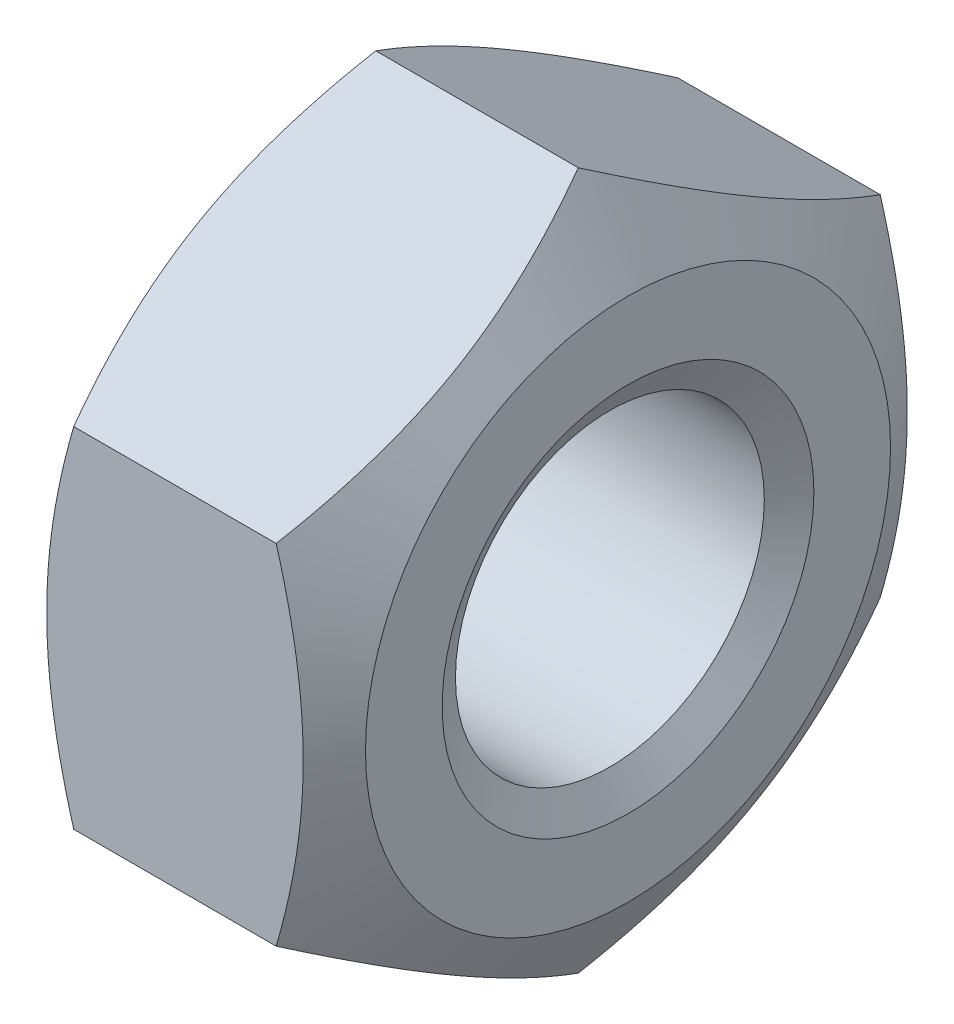
ISO-10303-21;
HEADER;
FILE_DESCRIPTION(('STEP AP214'),'2;1');
FILE_NAME('part.step','',(''),(''),'','','');
FILE_SCHEMA(('AUTOMOTIVE_DESIGN { 1 0 10303 214 1 1 1 1 }'));
ENDSEC;
DATA;
#1=APPLICATION_CONTEXT('core data for automotive mechanical design processes');
#2=APPLICATION_PROTOCOL_DEFINITION('international standard','automotive_design',2000,#1);
#3=PRODUCT_CONTEXT('',#1,'mechanical');
#4=PRODUCT('Part','Part','',(#3));
#5=PRODUCT_RELATED_PRODUCT_CATEGORY('part','',(#4));
#6=PRODUCT_DEFINITION_FORMATION('','',#4);
#7=PRODUCT_DEFINITION_CONTEXT('part definition',#1,'design');
#8=PRODUCT_DEFINITION('design','',#6,#7);
#9=PRODUCT_DEFINITION_SHAPE('','',#8);
#10=(LENGTH_UNIT() NAMED_UNIT(*) SI_UNIT(.MILLI.,.METRE.));
#11=(NAMED_UNIT(*) PLANE_ANGLE_UNIT() SI_UNIT($,.RADIAN.));
#12=(NAMED_UNIT(*) SI_UNIT($,.STERADIAN.) SOLID_ANGLE_UNIT());
#13=UNCERTAINTY_MEASURE_WITH_UNIT(LENGTH_MEASURE(1.E-05),#10,'distance_accuracy_value','');
#14=(GEOMETRIC_REPRESENTATION_CONTEXT(3) GLOBAL_UNCERTAINTY_ASSIGNED_CONTEXT((#13)) GLOBAL_UNIT_ASSIGNED_CONTEXT((#10,
#11,#12)) REPRESENTATION_CONTEXT('',''));
#15=CARTESIAN_POINT('',(0.,0.,0.));
#16=DIRECTION('',(0.,0.,1.));
#17=DIRECTION('',(1.,0.,0.));
#18=AXIS2_PLACEMENT_3D('',#15,#16,#17);
#19=CARTESIAN_POINT('',(0.,-7.50555349946513,0.));
#20=DIRECTION('',(0.,-0.866025403784439,0.5));
#21=DIRECTION('',(-1.,0.,0.));
#22=AXIS2_PLACEMENT_3D('',#19,#20,#21);
#23=PLANE('',#22);
#24=CARTESIAN_POINT('',(1.07130431241195,-3.75277674973257,6.5));
#25=CARTESIAN_POINT('',(-0.0120290209213858,-5.62916512459886,3.25));
#26=CARTESIAN_POINT('',(1.07130431241195,-7.50555349946513,0.));
#27=(BOUNDED_CURVE() B_SPLINE_CURVE(2,(#24,#25,#26),.UNSPECIFIED.,.F.,
.F.) B_SPLINE_CURVE_WITH_KNOTS((3,3),(0.,0.759483489750647),
.UNSPECIFIED.) CURVE() GEOMETRIC_REPRESENTATION_ITEM() RATIONAL_B_SPLINE_CURVE((1.,
1.15470053837925,1.)) REPRESENTATION_ITEM(''));
#28=CARTESIAN_POINT('',(1.07130431241195,-3.75277674973257,6.5));
#29=VERTEX_POINT('',#28);
#30=CARTESIAN_POINT('',(1.07130431241195,-7.50555349946513,0.));
#31=VERTEX_POINT('',#30);
#32=EDGE_CURVE('E173',#29,#31,#27,.T.);
#33=ORIENTED_EDGE('',*,*,#32,.T.);
#34=DIRECTION('',(1.,0.,0.));
#35=VECTOR('',#34,1.);
#36=CARTESIAN_POINT('',(0.,-7.50555349946513,0.));
#37=LINE('',#36,#35);
#38=CARTESIAN_POINT('',(5.42869568758805,-7.50555349946513,0.));
#39=VERTEX_POINT('',#38);
#40=EDGE_CURVE('E11',#31,#39,#37,.T.);
#41=ORIENTED_EDGE('',*,*,#40,.T.);
#42=CARTESIAN_POINT('',(5.42869568758805,-7.50555349946513,0.));
#43=CARTESIAN_POINT('',(6.51202902092139,-5.62916512459885,3.25));
#44=CARTESIAN_POINT('',(5.42869568758805,-3.75277674973257,6.5));
#45=(BOUNDED_CURVE() B_SPLINE_CURVE(2,(#42,#43,#44),.UNSPECIFIED.,.F.,
.F.) B_SPLINE_CURVE_WITH_KNOTS((3,3),(0.,0.759483489750646),
.UNSPECIFIED.) CURVE() GEOMETRIC_REPRESENTATION_ITEM() RATIONAL_B_SPLINE_CURVE((1.,
1.15470053837924,1.)) REPRESENTATION_ITEM(''));
#46=CARTESIAN_POINT('',(5.42869568758805,-3.75277674973257,6.5));
#47=VERTEX_POINT('',#46);
#48=EDGE_CURVE('E150',#39,#47,#45,.T.);
#49=ORIENTED_EDGE('',*,*,#48,.T.);
#50=DIRECTION('',(1.,0.,0.));
#51=VECTOR('',#50,1.);
#52=CARTESIAN_POINT('',(0.,-3.75277674973257,6.5));
#53=LINE('',#52,#51);
#54=EDGE_CURVE('E28',#29,#47,#53,.T.);
#55=ORIENTED_EDGE('',*,*,#54,.F.);
#56=EDGE_LOOP('',(#33,#41,#49,#55));
#57=FACE_BOUND('',#56,.T.);
#58=ADVANCED_FACE('F17',(#57),#23,.T.);
#59=CARTESIAN_POINT('',(0.,-3.75277674973255,-6.5));
#60=DIRECTION('',(0.,-0.866025403784438,-0.5));
#61=DIRECTION('',(0.,0.5,-0.866025403784438));
#62=AXIS2_PLACEMENT_3D('',#59,#60,#61);
#63=PLANE('',#62);
#64=CARTESIAN_POINT('',(1.07130431241195,-7.50555349946513,0.));
#65=CARTESIAN_POINT('',(-0.0120290209213908,-5.62916512459886,-3.25));
#66=CARTESIAN_POINT('',(1.07130431241195,-3.75277674973255,-6.5));
#67=(BOUNDED_CURVE() B_SPLINE_CURVE(2,(#64,#65,#66),.UNSPECIFIED.,.F.,
.F.) B_SPLINE_CURVE_WITH_KNOTS((3,3),(0.,0.759483489750649),
.UNSPECIFIED.) CURVE() GEOMETRIC_REPRESENTATION_ITEM() RATIONAL_B_SPLINE_CURVE((1.,
1.15470053837925,1.)) REPRESENTATION_ITEM(''));
#68=CARTESIAN_POINT('',(1.07130431241195,-3.75277674973254,-6.5));
#69=VERTEX_POINT('',#68);
#70=EDGE_CURVE('E174',#31,#69,#67,.T.);
#71=ORIENTED_EDGE('',*,*,#70,.T.);
#72=DIRECTION('',(1.,0.,0.));
#73=VECTOR('',#72,1.);
#74=CARTESIAN_POINT('',(0.,-3.75277674973255,-6.5));
#75=LINE('',#74,#73);
#76=CARTESIAN_POINT('',(5.42869568758805,-3.75277674973254,-6.5));
#77=VERTEX_POINT('',#76);
#78=EDGE_CURVE('E88',#69,#77,#75,.T.);
#79=ORIENTED_EDGE('',*,*,#78,.T.);
#80=CARTESIAN_POINT('',(5.42869568758805,-3.75277674973256,-6.5));
#81=CARTESIAN_POINT('',(6.51202902092139,-5.62916512459881,-3.25));
#82=CARTESIAN_POINT('',(5.42869568758805,-7.50555349946513,0.));
#83=(BOUNDED_CURVE() B_SPLINE_CURVE(2,(#80,#81,#82),.UNSPECIFIED.,.F.,
.F.) B_SPLINE_CURVE_WITH_KNOTS((3,3),(0.,0.759483489750648),
.UNSPECIFIED.) CURVE() GEOMETRIC_REPRESENTATION_ITEM() RATIONAL_B_SPLINE_CURVE((1.,
1.15470053837926,1.)) REPRESENTATION_ITEM(''));
#84=EDGE_CURVE('E121',#77,#39,#83,.T.);
#85=ORIENTED_EDGE('',*,*,#84,.T.);
#86=ORIENTED_EDGE('',*,*,#40,.F.);
#87=EDGE_LOOP('',(#71,#79,#85,#86));
#88=FACE_BOUND('',#87,.T.);
#89=ADVANCED_FACE('F274',(#88),#63,.T.);
#90=CARTESIAN_POINT('',(0.,-3.75277674973257,6.5));
#91=DIRECTION('',(0.,0.,1.));
#92=DIRECTION('',(1.,0.,0.));
#93=AXIS2_PLACEMENT_3D('',#90,#91,#92);
#94=PLANE('',#93);
#95=CARTESIAN_POINT('',(1.07130431241195,3.75277674973257,6.5));
#96=CARTESIAN_POINT('',(-0.0120290209213879,0.,6.50000000000001));
#97=CARTESIAN_POINT('',(1.07130431241195,-3.75277674973257,6.5));
#98=(BOUNDED_CURVE() B_SPLINE_CURVE(2,(#95,#96,#97),.UNSPECIFIED.,.F.,
.F.) B_SPLINE_CURVE_WITH_KNOTS((3,3),(0.,0.759483489750648),
.UNSPECIFIED.) CURVE() GEOMETRIC_REPRESENTATION_ITEM() RATIONAL_B_SPLINE_CURVE((1.,
1.15470053837925,1.)) REPRESENTATION_ITEM(''));
#99=CARTESIAN_POINT('',(1.07130431241195,3.75277674973257,6.5));
#100=VERTEX_POINT('',#99);
#101=EDGE_CURVE('E220',#100,#29,#98,.T.);
#102=ORIENTED_EDGE('',*,*,#101,.T.);
#103=ORIENTED_EDGE('',*,*,#54,.T.);
#104=CARTESIAN_POINT('',(5.42869568758805,-3.75277674973257,6.5));
#105=CARTESIAN_POINT('',(6.51202902092139,0.,6.50000000000001));
#106=CARTESIAN_POINT('',(5.42869568758805,3.75277674973257,6.5));
#107=(BOUNDED_CURVE() B_SPLINE_CURVE(2,(#104,#105,#106),.UNSPECIFIED.,.F.,
.F.) B_SPLINE_CURVE_WITH_KNOTS((3,3),(0.,0.759483489750647),
.UNSPECIFIED.) CURVE() GEOMETRIC_REPRESENTATION_ITEM() RATIONAL_B_SPLINE_CURVE((1.,
1.15470053837925,1.)) REPRESENTATION_ITEM(''));
#108=CARTESIAN_POINT('',(5.42869568758805,3.75277674973257,6.5));
#109=VERTEX_POINT('',#108);
#110=EDGE_CURVE('E156',#47,#109,#107,.T.);
#111=ORIENTED_EDGE('',*,*,#110,.T.);
#112=DIRECTION('',(1.,0.,0.));
#113=VECTOR('',#112,1.);
#114=CARTESIAN_POINT('',(0.,3.75277674973257,6.5));
#115=LINE('',#114,#113);
#116=EDGE_CURVE('E221',#100,#109,#115,.T.);
#117=ORIENTED_EDGE('',*,*,#116,.F.);
#118=EDGE_LOOP('',(#102,#103,#111,#117));
#119=FACE_BOUND('',#118,.T.);
#120=ADVANCED_FACE('F263',(#119),#94,.T.);
#121=CARTESIAN_POINT('',(0.,3.75277674973257,6.5));
#122=DIRECTION('',(0.,0.866025403784438,0.5));
#123=DIRECTION('',(1.,0.,0.));
#124=AXIS2_PLACEMENT_3D('',#121,#122,#123);
#125=PLANE('',#124);
#126=CARTESIAN_POINT('',(1.07130431241195,7.50555349946513,0.));
#127=CARTESIAN_POINT('',(-0.0120290209213866,5.62916512459886,3.25));
#128=CARTESIAN_POINT('',(1.07130431241195,3.75277674973256,6.5));
#129=(BOUNDED_CURVE() B_SPLINE_CURVE(2,(#126,#127,#128),.UNSPECIFIED.,.F.,
.F.) B_SPLINE_CURVE_WITH_KNOTS((3,3),(0.,0.759483489750648),
.UNSPECIFIED.) CURVE() GEOMETRIC_REPRESENTATION_ITEM() RATIONAL_B_SPLINE_CURVE((1.,
1.15470053837925,1.)) REPRESENTATION_ITEM(''));
#130=CARTESIAN_POINT('',(1.07130431241195,7.50555349946513,0.));
#131=VERTEX_POINT('',#130);
#132=EDGE_CURVE('E144',#131,#100,#129,.T.);
#133=ORIENTED_EDGE('',*,*,#132,.T.);
#134=ORIENTED_EDGE('',*,*,#116,.T.);
#135=CARTESIAN_POINT('',(5.42869568758805,3.75277674973256,6.5));
#136=CARTESIAN_POINT('',(6.51202902092139,5.62916512459886,3.25));
#137=CARTESIAN_POINT('',(5.42869568758805,7.50555349946513,0.));
#138=(BOUNDED_CURVE() B_SPLINE_CURVE(2,(#135,#136,#137),.UNSPECIFIED.,.F.,
.F.) B_SPLINE_CURVE_WITH_KNOTS((3,3),(0.,0.759483489750647),
.UNSPECIFIED.) CURVE() GEOMETRIC_REPRESENTATION_ITEM() RATIONAL_B_SPLINE_CURVE((1.,
1.15470053837925,1.)) REPRESENTATION_ITEM(''));
#139=CARTESIAN_POINT('',(5.42869568758805,7.50555349946513,0.));
#140=VERTEX_POINT('',#139);
#141=EDGE_CURVE('E116',#109,#140,#138,.T.);
#142=ORIENTED_EDGE('',*,*,#141,.T.);
#143=DIRECTION('',(1.,0.,0.));
#144=VECTOR('',#143,1.);
#145=CARTESIAN_POINT('',(0.,7.50555349946513,0.));
#146=LINE('',#145,#144);
#147=EDGE_CURVE('E107',#131,#140,#146,.T.);
#148=ORIENTED_EDGE('',*,*,#147,.F.);
#149=EDGE_LOOP('',(#133,#134,#142,#148));
#150=FACE_BOUND('',#149,.T.);
#151=ADVANCED_FACE('F260',(#150),#125,.T.);
#152=CARTESIAN_POINT('',(0.,3.75277674973258,-6.5));
#153=DIRECTION('',(0.,0.,-1.));
#154=DIRECTION('',(-1.,0.,0.));
#155=AXIS2_PLACEMENT_3D('',#152,#153,#154);
#156=PLANE('',#155);
#157=CARTESIAN_POINT('',(1.07130431241195,-3.75277674973254,-6.5));
#158=CARTESIAN_POINT('',(-0.012029020921378,0.,-6.50000000000001));
#159=CARTESIAN_POINT('',(1.07130431241195,3.75277674973257,-6.5));
#160=(BOUNDED_CURVE() B_SPLINE_CURVE(2,(#157,#158,#159),.UNSPECIFIED.,.F.,
.F.) B_SPLINE_CURVE_WITH_KNOTS((3,3),(0.,0.759483489750644),
.UNSPECIFIED.) CURVE() GEOMETRIC_REPRESENTATION_ITEM() RATIONAL_B_SPLINE_CURVE((1.,
1.15470053837925,1.)) REPRESENTATION_ITEM(''));
#161=CARTESIAN_POINT('',(1.07130431241195,3.75277674973259,-6.5));
#162=VERTEX_POINT('',#161);
#163=EDGE_CURVE('E102',#69,#162,#160,.T.);
#164=ORIENTED_EDGE('',*,*,#163,.T.);
#165=DIRECTION('',(1.,0.,0.));
#166=VECTOR('',#165,1.);
#167=CARTESIAN_POINT('',(0.,3.75277674973258,-6.5));
#168=LINE('',#167,#166);
#169=CARTESIAN_POINT('',(5.42869568758805,3.75277674973259,-6.5));
#170=VERTEX_POINT('',#169);
#171=EDGE_CURVE('E95',#162,#170,#168,.T.);
#172=ORIENTED_EDGE('',*,*,#171,.T.);
#173=CARTESIAN_POINT('',(5.42869568758805,3.75277674973256,-6.5));
#174=CARTESIAN_POINT('',(6.51202902092138,0.,-6.50000000000001));
#175=CARTESIAN_POINT('',(5.42869568758805,-3.75277674973253,-6.5));
#176=(BOUNDED_CURVE() B_SPLINE_CURVE(2,(#173,#174,#175),.UNSPECIFIED.,.F.,
.F.) B_SPLINE_CURVE_WITH_KNOTS((3,3),(0.,0.759483489750643),
.UNSPECIFIED.) CURVE() GEOMETRIC_REPRESENTATION_ITEM() RATIONAL_B_SPLINE_CURVE((1.,
1.15470053837925,1.)) REPRESENTATION_ITEM(''));
#177=EDGE_CURVE('E99',#170,#77,#176,.T.);
#178=ORIENTED_EDGE('',*,*,#177,.T.);
#179=ORIENTED_EDGE('',*,*,#78,.F.);
#180=EDGE_LOOP('',(#164,#172,#178,#179));
#181=FACE_BOUND('',#180,.T.);
#182=ADVANCED_FACE('F97',(#181),#156,.T.);
#183=CARTESIAN_POINT('',(0.,7.50555349946513,0.));
#184=DIRECTION('',(0.,0.866025403784439,-0.5));
#185=DIRECTION('',(-1.,0.,0.));
#186=AXIS2_PLACEMENT_3D('',#183,#184,#185);
#187=PLANE('',#186);
#188=CARTESIAN_POINT('',(1.07130431241195,3.75277674973259,-6.5));
#189=CARTESIAN_POINT('',(-0.012029020921379,5.62916512459886,-3.24999999999999));
#190=CARTESIAN_POINT('',(1.07130431241195,7.50555349946513,0.));
#191=(BOUNDED_CURVE() B_SPLINE_CURVE(2,(#188,#189,#190),.UNSPECIFIED.,.F.,
.F.) B_SPLINE_CURVE_WITH_KNOTS((3,3),(0.,0.759483489750645),
.UNSPECIFIED.) CURVE() GEOMETRIC_REPRESENTATION_ITEM() RATIONAL_B_SPLINE_CURVE((1.,
1.15470053837925,1.)) REPRESENTATION_ITEM(''));
#192=EDGE_CURVE('E136',#162,#131,#191,.T.);
#193=ORIENTED_EDGE('',*,*,#192,.T.);
#194=ORIENTED_EDGE('',*,*,#147,.T.);
#195=CARTESIAN_POINT('',(5.42869568758805,7.50555349946513,0.));
#196=CARTESIAN_POINT('',(6.51202902092138,5.62916512459886,-3.25));
#197=CARTESIAN_POINT('',(5.42869568758805,3.75277674973259,-6.5));
#198=(BOUNDED_CURVE() B_SPLINE_CURVE(2,(#195,#196,#197),.UNSPECIFIED.,.F.,
.F.) B_SPLINE_CURVE_WITH_KNOTS((3,3),(0.,0.759483489750644),
.UNSPECIFIED.) CURVE() GEOMETRIC_REPRESENTATION_ITEM() RATIONAL_B_SPLINE_CURVE((1.,
1.15470053837925,1.)) REPRESENTATION_ITEM(''));
#199=EDGE_CURVE('E110',#140,#170,#198,.T.);
#200=ORIENTED_EDGE('',*,*,#199,.T.);
#201=ORIENTED_EDGE('',*,*,#171,.F.);
#202=EDGE_LOOP('',(#193,#194,#200,#201));
#203=FACE_BOUND('',#202,.T.);
#204=ADVANCED_FACE('F111',(#203),#187,.T.);
#205=CARTESIAN_POINT('',(5.96434784379403,0.,0.));
#206=DIRECTION('',(-1.,0.,0.));
#207=DIRECTION('',(0.,1.,0.));
#208=AXIS2_PLACEMENT_3D('',#205,#206,#207);
#209=CONICAL_SURFACE('',#208,6.57777674973257,1.0471975511966);
#210=CARTESIAN_POINT('',(6.5,0.,0.));
#211=DIRECTION('',(1.,0.,0.));
#212=DIRECTION('',(0.,1.,0.));
#213=AXIS2_PLACEMENT_3D('',#210,#211,#212);
#214=CIRCLE('',#213,5.65);
#215=CARTESIAN_POINT('',(6.5,-5.65,0.));
#216=VERTEX_POINT('',#215);
#217=EDGE_CURVE('E216',#216,#216,#214,.T.);
#218=ORIENTED_EDGE('',*,*,#217,.F.);
#219=DIRECTION('',(-0.5,-0.866025403784439,0.));
#220=VECTOR('',#219,1.);
#221=CARTESIAN_POINT('',(5.96434784379403,-6.57777674973257,0.));
#222=LINE('',#221,#220);
#223=EDGE_CURVE('E128',#216,#39,#222,.T.);
#224=ORIENTED_EDGE('',*,*,#223,.T.);
#225=ORIENTED_EDGE('',*,*,#84,.F.);
#226=ORIENTED_EDGE('',*,*,#177,.F.);
#227=ORIENTED_EDGE('',*,*,#199,.F.);
#228=ORIENTED_EDGE('',*,*,#141,.F.);
#229=ORIENTED_EDGE('',*,*,#110,.F.);
#230=ORIENTED_EDGE('',*,*,#48,.F.);
#231=ORIENTED_EDGE('',*,*,#223,.F.);
#232=EDGE_LOOP('',(#218,#224,#225,#226,#227,#228,#229,#230,#231));
#233=FACE_BOUND('',#232,.T.);
#234=ADVANCED_FACE('F119',(#233),#209,.T.);
#235=CARTESIAN_POINT('',(0.535652156205973,0.,0.));
#236=DIRECTION('',(1.,0.,0.));
#237=DIRECTION('',(0.,1.,0.));
#238=AXIS2_PLACEMENT_3D('',#235,#236,#237);
#239=CONICAL_SURFACE('',#238,6.57777674973257,1.0471975511966);
#240=ORIENTED_EDGE('',*,*,#101,.F.);
#241=ORIENTED_EDGE('',*,*,#132,.F.);
#242=ORIENTED_EDGE('',*,*,#192,.F.);
#243=ORIENTED_EDGE('',*,*,#163,.F.);
#244=ORIENTED_EDGE('',*,*,#70,.F.);
#245=DIRECTION('',(-0.5,0.866025403784439,0.));
#246=VECTOR('',#245,1.);
#247=CARTESIAN_POINT('',(0.535652156205973,-6.57777674973257,0.));
#248=LINE('',#247,#246);
#249=CARTESIAN_POINT('',(0.,-5.65,0.));
#250=VERTEX_POINT('',#249);
#251=EDGE_CURVE('E169',#31,#250,#248,.T.);
#252=ORIENTED_EDGE('',*,*,#251,.T.);
#253=CARTESIAN_POINT('',(0.,0.,0.));
#254=DIRECTION('',(-1.,0.,0.));
#255=DIRECTION('',(0.,1.,0.));
#256=AXIS2_PLACEMENT_3D('',#253,#254,#255);
#257=CIRCLE('',#256,5.65);
#258=EDGE_CURVE('E21',#250,#250,#257,.T.);
#259=ORIENTED_EDGE('',*,*,#258,.F.);
#260=ORIENTED_EDGE('',*,*,#251,.F.);
#261=ORIENTED_EDGE('',*,*,#32,.F.);
#262=EDGE_LOOP('',(#240,#241,#242,#243,#244,#252,#259,#260,#261));
#263=FACE_BOUND('',#262,.T.);
#264=ADVANCED_FACE('F269',(#263),#239,.T.);
#265=CARTESIAN_POINT('',(6.5,0.,0.));
#266=DIRECTION('',(1.,0.,0.));
#267=DIRECTION('',(0.,1.,0.));
#268=AXIS2_PLACEMENT_3D('',#265,#266,#267);
#269=PLANE('',#268);
#270=CARTESIAN_POINT('',(6.5,0.,0.));
#271=DIRECTION('',(1.,0.,0.));
#272=DIRECTION('',(0.,0.,1.));
#273=AXIS2_PLACEMENT_3D('',#270,#271,#272);
#274=CIRCLE('',#273,4.00008234670659);
#275=CARTESIAN_POINT('',(6.5,0.,-4.00008234670659));
#276=VERTEX_POINT('',#275);
#277=EDGE_CURVE('E134',#276,#276,#274,.T.);
#278=ORIENTED_EDGE('',*,*,#277,.F.);
#279=EDGE_LOOP('',(#278));
#280=FACE_BOUND('',#279,.T.);
#281=ORIENTED_EDGE('',*,*,#217,.T.);
#282=EDGE_LOOP('',(#281));
#283=FACE_BOUND('',#282,.T.);
#284=ADVANCED_FACE('F276',(#280,#283),#269,.T.);
#285=CARTESIAN_POINT('',(6.3046875,0.,0.));
#286=DIRECTION('',(1.,0.,0.));
#287=DIRECTION('',(0.,0.,1.));
#288=AXIS2_PLACEMENT_3D('',#285,#286,#287);
#289=CONICAL_SURFACE('',#288,3.6617911733533,1.0471975511966);
#290=ORIENTED_EDGE('',*,*,#277,.T.);
#291=DIRECTION('',(-0.5,0.,0.866025403784438));
#292=VECTOR('',#291,1.);
#293=CARTESIAN_POINT('',(6.3046875,0.,-3.6617911733533));
#294=LINE('',#293,#292);
#295=CARTESIAN_POINT('',(6.109375,0.,-3.3235));
#296=VERTEX_POINT('',#295);
#297=EDGE_CURVE('E209',#276,#296,#294,.T.);
#298=ORIENTED_EDGE('',*,*,#297,.T.);
#299=CARTESIAN_POINT('',(6.109375,0.,0.));
#300=DIRECTION('',(-1.,0.,0.));
#301=DIRECTION('',(0.,0.,1.));
#302=AXIS2_PLACEMENT_3D('',#299,#300,#301);
#303=CIRCLE('',#302,3.3235);
#304=CARTESIAN_POINT('',(6.109375,0.,3.3235));
#305=VERTEX_POINT('',#304);
#306=EDGE_CURVE('E175',#296,#305,#303,.T.);
#307=ORIENTED_EDGE('',*,*,#306,.T.);
#308=CARTESIAN_POINT('',(6.109375,0.,0.));
#309=DIRECTION('',(-1.,0.,0.));
#310=DIRECTION('',(0.,0.,1.));
#311=AXIS2_PLACEMENT_3D('',#308,#309,#310);
#312=CIRCLE('',#311,3.3235);
#313=EDGE_CURVE('E155',#305,#296,#312,.T.);
#314=ORIENTED_EDGE('',*,*,#313,.T.);
#315=ORIENTED_EDGE('',*,*,#297,.F.);
#316=EDGE_LOOP('',(#290,#298,#307,#314,#315));
#317=FACE_BOUND('',#316,.T.);
#318=ADVANCED_FACE('F278',(#317),#289,.F.);
#319=CARTESIAN_POINT('',(0.,0.,0.));
#320=DIRECTION('',(1.,0.,0.));
#321=DIRECTION('',(0.,1.,0.));
#322=AXIS2_PLACEMENT_3D('',#319,#320,#321);
#323=PLANE('',#322);
#324=CARTESIAN_POINT('',(0.,0.,0.));
#325=DIRECTION('',(-1.,0.,0.));
#326=DIRECTION('',(0.,0.,-1.));
#327=AXIS2_PLACEMENT_3D('',#324,#325,#326);
#328=CIRCLE('',#327,4.00008234670659);
#329=CARTESIAN_POINT('',(0.,0.,4.00008234670659));
#330=VERTEX_POINT('',#329);
#331=EDGE_CURVE('E161',#330,#330,#328,.T.);
#332=ORIENTED_EDGE('',*,*,#331,.F.);
#333=EDGE_LOOP('',(#332));
#334=FACE_BOUND('',#333,.T.);
#335=ORIENTED_EDGE('',*,*,#258,.T.);
#336=EDGE_LOOP('',(#335));
#337=FACE_BOUND('',#336,.T.);
#338=ADVANCED_FACE('F286',(#334,#337),#323,.F.);
#339=CARTESIAN_POINT('',(-14.4020732623983,0.,0.));
#340=DIRECTION('',(1.,0.,0.));
#341=DIRECTION('',(0.,0.,-1.));
#342=AXIS2_PLACEMENT_3D('',#339,#340,#341);
#343=CYLINDRICAL_SURFACE('',#342,3.3235);
#344=ORIENTED_EDGE('',*,*,#306,.F.);
#345=ORIENTED_EDGE('',*,*,#313,.F.);
#346=DIRECTION('',(-1.,0.,0.));
#347=VECTOR('',#346,1.);
#348=CARTESIAN_POINT('',(-14.4020732623983,0.,3.3235));
#349=LINE('',#348,#347);
#350=CARTESIAN_POINT('',(0.390625,0.,3.3235));
#351=VERTEX_POINT('',#350);
#352=EDGE_CURVE('E151',#305,#351,#349,.T.);
#353=ORIENTED_EDGE('',*,*,#352,.T.);
#354=CARTESIAN_POINT('',(0.390625,0.,0.));
#355=DIRECTION('',(1.,0.,0.));
#356=DIRECTION('',(0.,0.,-1.));
#357=AXIS2_PLACEMENT_3D('',#354,#355,#356);
#358=CIRCLE('',#357,3.3235);
#359=EDGE_CURVE('E178',#351,#351,#358,.T.);
#360=ORIENTED_EDGE('',*,*,#359,.F.);
#361=ORIENTED_EDGE('',*,*,#352,.F.);
#362=EDGE_LOOP('',(#344,#345,#353,#360,#361));
#363=FACE_BOUND('',#362,.T.);
#364=ADVANCED_FACE('F299',(#363),#343,.F.);
#365=CARTESIAN_POINT('',(0.1953125,0.,0.));
#366=DIRECTION('',(-1.,0.,0.));
#367=DIRECTION('',(0.,0.,-1.));
#368=AXIS2_PLACEMENT_3D('',#365,#366,#367);
#369=CONICAL_SURFACE('',#368,3.6617911733533,1.0471975511966);
#370=ORIENTED_EDGE('',*,*,#331,.T.);
#371=DIRECTION('',(0.5,0.,-0.866025403784439));
#372=VECTOR('',#371,1.);
#373=CARTESIAN_POINT('',(0.1953125,0.,3.6617911733533));
#374=LINE('',#373,#372);
#375=EDGE_CURVE('E167',#330,#351,#374,.T.);
#376=ORIENTED_EDGE('',*,*,#375,.T.);
#377=ORIENTED_EDGE('',*,*,#359,.T.);
#378=ORIENTED_EDGE('',*,*,#375,.F.);
#379=EDGE_LOOP('',(#370,#376,#377,#378));
#380=FACE_BOUND('',#379,.T.);
#381=ADVANCED_FACE('F19',(#380),#369,.F.);
#382=CLOSED_SHELL('',(#58,#89,#120,#151,#182,#204,#234,#264,#284,#318,#338,#364,#381));
#383=MANIFOLD_SOLID_BREP('B1',#382);
#384=ADVANCED_BREP_SHAPE_REPRESENTATION('',(#18,#383),#14);
#385=SHAPE_DEFINITION_REPRESENTATION(#9,#384);
ENDSEC;
END-ISO-10303-21;
